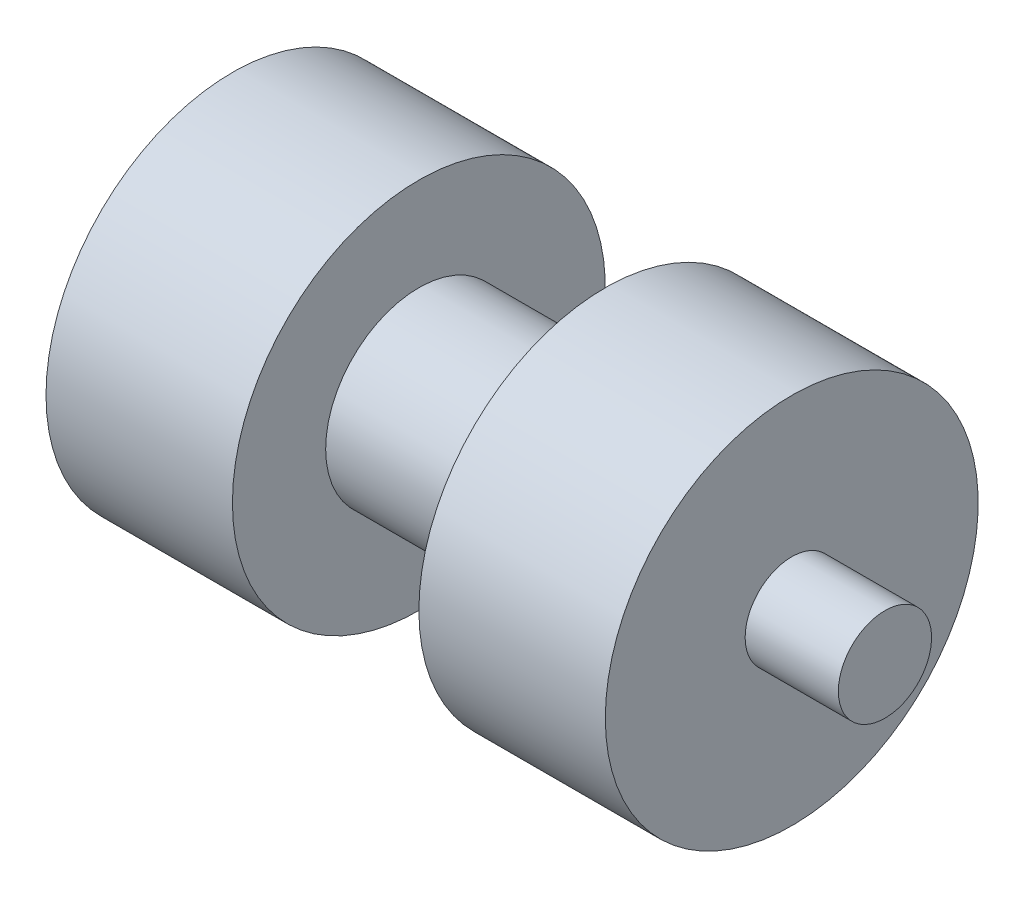
ISO-10303-21;
HEADER;
FILE_DESCRIPTION(('STEP AP214'),'2;1');
FILE_NAME('part.step','',(''),(''),'','','');
FILE_SCHEMA(('AUTOMOTIVE_DESIGN { 1 0 10303 214 1 1 1 1 }'));
ENDSEC;
DATA;
#1=APPLICATION_CONTEXT('core data for automotive mechanical design processes');
#2=APPLICATION_PROTOCOL_DEFINITION('international standard','automotive_design',2000,#1);
#3=PRODUCT_CONTEXT('',#1,'mechanical');
#4=PRODUCT('Part','Part','',(#3));
#5=PRODUCT_RELATED_PRODUCT_CATEGORY('part','',(#4));
#6=PRODUCT_DEFINITION_FORMATION('','',#4);
#7=PRODUCT_DEFINITION_CONTEXT('part definition',#1,'design');
#8=PRODUCT_DEFINITION('design','',#6,#7);
#9=PRODUCT_DEFINITION_SHAPE('','',#8);
#10=(LENGTH_UNIT() NAMED_UNIT(*) SI_UNIT(.MILLI.,.METRE.));
#11=(NAMED_UNIT(*) PLANE_ANGLE_UNIT() SI_UNIT($,.RADIAN.));
#12=(NAMED_UNIT(*) SI_UNIT($,.STERADIAN.) SOLID_ANGLE_UNIT());
#13=UNCERTAINTY_MEASURE_WITH_UNIT(LENGTH_MEASURE(1.E-05),#10,'distance_accuracy_value','');
#14=(GEOMETRIC_REPRESENTATION_CONTEXT(3) GLOBAL_UNCERTAINTY_ASSIGNED_CONTEXT((#13)) GLOBAL_UNIT_ASSIGNED_CONTEXT((#10,
#11,#12)) REPRESENTATION_CONTEXT('',''));
#15=CARTESIAN_POINT('',(0.,0.,0.));
#16=DIRECTION('',(0.,0.,1.));
#17=DIRECTION('',(1.,0.,0.));
#18=AXIS2_PLACEMENT_3D('',#15,#16,#17);
#19=CARTESIAN_POINT('',(-5.,10.,0.));
#20=DIRECTION('',(-1.,0.,0.));
#21=DIRECTION('',(0.,0.,1.));
#22=AXIS2_PLACEMENT_3D('',#19,#20,#21);
#23=PLANE('',#22);
#24=CARTESIAN_POINT('',(-5.,0.,0.));
#25=DIRECTION('',(-1.,0.,0.));
#26=DIRECTION('',(0.,0.,1.));
#27=AXIS2_PLACEMENT_3D('',#24,#25,#26);
#28=CIRCLE('',#27,10.);
#29=CARTESIAN_POINT('',(-5.,0.,10.));
#30=VERTEX_POINT('',#29);
#31=EDGE_CURVE('E10',#30,#30,#28,.T.);
#32=ORIENTED_EDGE('',*,*,#31,.F.);
#33=EDGE_LOOP('',(#32));
#34=FACE_BOUND('',#33,.T.);
#35=CARTESIAN_POINT('',(-5.,0.,0.));
#36=DIRECTION('',(-1.,0.,0.));
#37=DIRECTION('',(0.,0.,1.));
#38=AXIS2_PLACEMENT_3D('',#35,#36,#37);
#39=CIRCLE('',#38,5.);
#40=CARTESIAN_POINT('',(-5.,0.,5.));
#41=VERTEX_POINT('',#40);
#42=EDGE_CURVE('E86',#41,#41,#39,.T.);
#43=ORIENTED_EDGE('',*,*,#42,.T.);
#44=EDGE_LOOP('',(#43));
#45=FACE_BOUND('',#44,.T.);
#46=ADVANCED_FACE('F43',(#34,#45),#23,.F.);
#47=CARTESIAN_POINT('',(-20.,0.,0.));
#48=DIRECTION('',(-1.,0.,0.));
#49=DIRECTION('',(0.,0.,1.));
#50=AXIS2_PLACEMENT_3D('',#47,#48,#49);
#51=CYLINDRICAL_SURFACE('',#50,10.);
#52=CARTESIAN_POINT('',(-15.,0.,0.));
#53=DIRECTION('',(-1.,0.,0.));
#54=DIRECTION('',(0.,0.,1.));
#55=AXIS2_PLACEMENT_3D('',#52,#53,#54);
#56=CIRCLE('',#55,10.);
#57=CARTESIAN_POINT('',(-15.,0.,10.));
#58=VERTEX_POINT('',#57);
#59=EDGE_CURVE('E50',#58,#58,#56,.T.);
#60=ORIENTED_EDGE('',*,*,#59,.F.);
#61=EDGE_LOOP('',(#60));
#62=FACE_BOUND('',#61,.T.);
#63=ORIENTED_EDGE('',*,*,#31,.T.);
#64=EDGE_LOOP('',(#63));
#65=FACE_BOUND('',#64,.T.);
#66=ADVANCED_FACE('F133',(#62,#65),#51,.T.);
#67=CARTESIAN_POINT('',(-15.,2.5,0.));
#68=DIRECTION('',(1.,0.,0.));
#69=DIRECTION('',(0.,0.,-1.));
#70=AXIS2_PLACEMENT_3D('',#67,#68,#69);
#71=PLANE('',#70);
#72=CARTESIAN_POINT('',(-15.,0.,0.));
#73=DIRECTION('',(-1.,0.,0.));
#74=DIRECTION('',(0.,0.,1.));
#75=AXIS2_PLACEMENT_3D('',#72,#73,#74);
#76=CIRCLE('',#75,2.5);
#77=CARTESIAN_POINT('',(-15.,0.,2.5));
#78=VERTEX_POINT('',#77);
#79=EDGE_CURVE('E55',#78,#78,#76,.T.);
#80=ORIENTED_EDGE('',*,*,#79,.F.);
#81=EDGE_LOOP('',(#80));
#82=FACE_BOUND('',#81,.T.);
#83=ORIENTED_EDGE('',*,*,#59,.T.);
#84=EDGE_LOOP('',(#83));
#85=FACE_BOUND('',#84,.T.);
#86=ADVANCED_FACE('F138',(#82,#85),#71,.F.);
#87=CARTESIAN_POINT('',(-20.,0.,0.));
#88=DIRECTION('',(-1.,0.,0.));
#89=DIRECTION('',(0.,0.,1.));
#90=AXIS2_PLACEMENT_3D('',#87,#88,#89);
#91=CYLINDRICAL_SURFACE('',#90,2.5);
#92=CARTESIAN_POINT('',(-20.,0.,0.));
#93=DIRECTION('',(-1.,0.,0.));
#94=DIRECTION('',(0.,0.,1.));
#95=AXIS2_PLACEMENT_3D('',#92,#93,#94);
#96=CIRCLE('',#95,2.5);
#97=CARTESIAN_POINT('',(-20.,0.,2.5));
#98=VERTEX_POINT('',#97);
#99=EDGE_CURVE('E60',#98,#98,#96,.T.);
#100=ORIENTED_EDGE('',*,*,#99,.F.);
#101=EDGE_LOOP('',(#100));
#102=FACE_BOUND('',#101,.T.);
#103=ORIENTED_EDGE('',*,*,#79,.T.);
#104=EDGE_LOOP('',(#103));
#105=FACE_BOUND('',#104,.T.);
#106=ADVANCED_FACE('F129',(#102,#105),#91,.T.);
#107=CARTESIAN_POINT('',(-20.,0.,0.));
#108=DIRECTION('',(1.,0.,0.));
#109=DIRECTION('',(0.,0.,-1.));
#110=AXIS2_PLACEMENT_3D('',#107,#108,#109);
#111=PLANE('',#110);
#112=ORIENTED_EDGE('',*,*,#99,.T.);
#113=EDGE_LOOP('',(#112));
#114=FACE_BOUND('',#113,.T.);
#115=ADVANCED_FACE('F124',(#114),#111,.F.);
#116=CARTESIAN_POINT('',(20.,2.5,0.));
#117=DIRECTION('',(-1.,0.,0.));
#118=DIRECTION('',(0.,0.,1.));
#119=AXIS2_PLACEMENT_3D('',#116,#117,#118);
#120=PLANE('',#119);
#121=CARTESIAN_POINT('',(20.,0.,0.));
#122=DIRECTION('',(-1.,0.,0.));
#123=DIRECTION('',(0.,0.,1.));
#124=AXIS2_PLACEMENT_3D('',#121,#122,#123);
#125=CIRCLE('',#124,2.5);
#126=CARTESIAN_POINT('',(20.,0.,2.5));
#127=VERTEX_POINT('',#126);
#128=EDGE_CURVE('E66',#127,#127,#125,.T.);
#129=ORIENTED_EDGE('',*,*,#128,.F.);
#130=EDGE_LOOP('',(#129));
#131=FACE_BOUND('',#130,.T.);
#132=ADVANCED_FACE('F119',(#131),#120,.F.);
#133=CARTESIAN_POINT('',(-20.,0.,0.));
#134=DIRECTION('',(-1.,0.,0.));
#135=DIRECTION('',(0.,0.,1.));
#136=AXIS2_PLACEMENT_3D('',#133,#134,#135);
#137=CYLINDRICAL_SURFACE('',#136,2.5);
#138=CARTESIAN_POINT('',(15.,0.,0.));
#139=DIRECTION('',(-1.,0.,0.));
#140=DIRECTION('',(0.,0.,1.));
#141=AXIS2_PLACEMENT_3D('',#138,#139,#140);
#142=CIRCLE('',#141,2.5);
#143=CARTESIAN_POINT('',(15.,0.,2.5));
#144=VERTEX_POINT('',#143);
#145=EDGE_CURVE('E70',#144,#144,#142,.T.);
#146=ORIENTED_EDGE('',*,*,#145,.F.);
#147=EDGE_LOOP('',(#146));
#148=FACE_BOUND('',#147,.T.);
#149=ORIENTED_EDGE('',*,*,#128,.T.);
#150=EDGE_LOOP('',(#149));
#151=FACE_BOUND('',#150,.T.);
#152=ADVANCED_FACE('F113',(#148,#151),#137,.T.);
#153=CARTESIAN_POINT('',(15.,10.,0.));
#154=DIRECTION('',(-1.,0.,0.));
#155=DIRECTION('',(0.,0.,1.));
#156=AXIS2_PLACEMENT_3D('',#153,#154,#155);
#157=PLANE('',#156);
#158=CARTESIAN_POINT('',(15.,0.,0.));
#159=DIRECTION('',(-1.,0.,0.));
#160=DIRECTION('',(0.,0.,1.));
#161=AXIS2_PLACEMENT_3D('',#158,#159,#160);
#162=CIRCLE('',#161,10.);
#163=CARTESIAN_POINT('',(15.,0.,10.));
#164=VERTEX_POINT('',#163);
#165=EDGE_CURVE('E74',#164,#164,#162,.T.);
#166=ORIENTED_EDGE('',*,*,#165,.F.);
#167=EDGE_LOOP('',(#166));
#168=FACE_BOUND('',#167,.T.);
#169=ORIENTED_EDGE('',*,*,#145,.T.);
#170=EDGE_LOOP('',(#169));
#171=FACE_BOUND('',#170,.T.);
#172=ADVANCED_FACE('F107',(#168,#171),#157,.F.);
#173=CARTESIAN_POINT('',(-20.,0.,0.));
#174=DIRECTION('',(-1.,0.,0.));
#175=DIRECTION('',(0.,0.,1.));
#176=AXIS2_PLACEMENT_3D('',#173,#174,#175);
#177=CYLINDRICAL_SURFACE('',#176,10.);
#178=CARTESIAN_POINT('',(5.,0.,0.));
#179=DIRECTION('',(-1.,0.,0.));
#180=DIRECTION('',(0.,0.,1.));
#181=AXIS2_PLACEMENT_3D('',#178,#179,#180);
#182=CIRCLE('',#181,10.);
#183=CARTESIAN_POINT('',(5.,0.,10.));
#184=VERTEX_POINT('',#183);
#185=EDGE_CURVE('E78',#184,#184,#182,.T.);
#186=ORIENTED_EDGE('',*,*,#185,.F.);
#187=EDGE_LOOP('',(#186));
#188=FACE_BOUND('',#187,.T.);
#189=ORIENTED_EDGE('',*,*,#165,.T.);
#190=EDGE_LOOP('',(#189));
#191=FACE_BOUND('',#190,.T.);
#192=ADVANCED_FACE('F101',(#188,#191),#177,.T.);
#193=CARTESIAN_POINT('',(5.,5.,0.));
#194=DIRECTION('',(1.,0.,0.));
#195=DIRECTION('',(0.,0.,-1.));
#196=AXIS2_PLACEMENT_3D('',#193,#194,#195);
#197=PLANE('',#196);
#198=CARTESIAN_POINT('',(5.,0.,0.));
#199=DIRECTION('',(-1.,0.,0.));
#200=DIRECTION('',(0.,0.,1.));
#201=AXIS2_PLACEMENT_3D('',#198,#199,#200);
#202=CIRCLE('',#201,5.);
#203=CARTESIAN_POINT('',(5.,0.,5.));
#204=VERTEX_POINT('',#203);
#205=EDGE_CURVE('E82',#204,#204,#202,.T.);
#206=ORIENTED_EDGE('',*,*,#205,.F.);
#207=EDGE_LOOP('',(#206));
#208=FACE_BOUND('',#207,.T.);
#209=ORIENTED_EDGE('',*,*,#185,.T.);
#210=EDGE_LOOP('',(#209));
#211=FACE_BOUND('',#210,.T.);
#212=ADVANCED_FACE('F95',(#208,#211),#197,.F.);
#213=CARTESIAN_POINT('',(-20.,0.,0.));
#214=DIRECTION('',(-1.,0.,0.));
#215=DIRECTION('',(0.,0.,1.));
#216=AXIS2_PLACEMENT_3D('',#213,#214,#215);
#217=CYLINDRICAL_SURFACE('',#216,5.);
#218=ORIENTED_EDGE('',*,*,#42,.F.);
#219=EDGE_LOOP('',(#218));
#220=FACE_BOUND('',#219,.T.);
#221=ORIENTED_EDGE('',*,*,#205,.T.);
#222=EDGE_LOOP('',(#221));
#223=FACE_BOUND('',#222,.T.);
#224=ADVANCED_FACE('F92',(#220,#223),#217,.T.);
#225=CLOSED_SHELL('',(#46,#66,#86,#106,#115,#132,#152,#172,#192,#212,#224));
#226=MANIFOLD_SOLID_BREP('B2',#225);
#227=ADVANCED_BREP_SHAPE_REPRESENTATION('',(#18,#226),#14);
#228=SHAPE_DEFINITION_REPRESENTATION(#9,#227);
ENDSEC;
END-ISO-10303-21;
